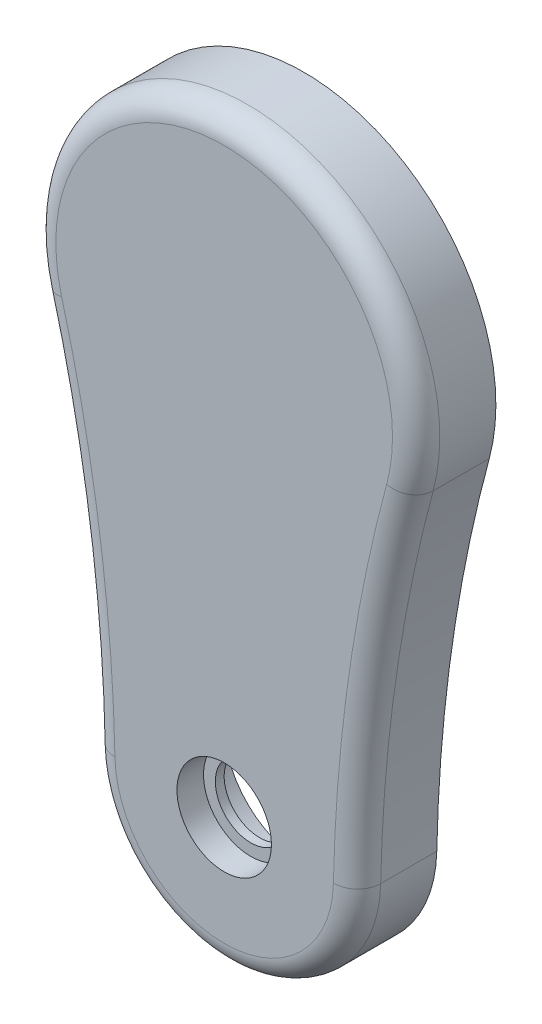
ISO-10303-21;
HEADER;
FILE_DESCRIPTION(('STEP AP214'),'2;1');
FILE_NAME('part.step','',(''),(''),'','','');
FILE_SCHEMA(('AUTOMOTIVE_DESIGN { 1 0 10303 214 1 1 1 1 }'));
ENDSEC;
DATA;
#1=APPLICATION_CONTEXT('core data for automotive mechanical design processes');
#2=APPLICATION_PROTOCOL_DEFINITION('international standard','automotive_design',2000,#1);
#3=PRODUCT_CONTEXT('',#1,'mechanical');
#4=PRODUCT('Part','Part','',(#3));
#5=PRODUCT_RELATED_PRODUCT_CATEGORY('part','',(#4));
#6=PRODUCT_DEFINITION_FORMATION('','',#4);
#7=PRODUCT_DEFINITION_CONTEXT('part definition',#1,'design');
#8=PRODUCT_DEFINITION('design','',#6,#7);
#9=PRODUCT_DEFINITION_SHAPE('','',#8);
#10=(LENGTH_UNIT() NAMED_UNIT(*) SI_UNIT(.MILLI.,.METRE.));
#11=(NAMED_UNIT(*) PLANE_ANGLE_UNIT() SI_UNIT($,.RADIAN.));
#12=(NAMED_UNIT(*) SI_UNIT($,.STERADIAN.) SOLID_ANGLE_UNIT());
#13=UNCERTAINTY_MEASURE_WITH_UNIT(LENGTH_MEASURE(1.E-05),#10,'distance_accuracy_value','');
#14=(GEOMETRIC_REPRESENTATION_CONTEXT(3) GLOBAL_UNCERTAINTY_ASSIGNED_CONTEXT((#13)) GLOBAL_UNIT_ASSIGNED_CONTEXT((#10,
#11,#12)) REPRESENTATION_CONTEXT('',''));
#15=CARTESIAN_POINT('',(0.,0.,0.));
#16=DIRECTION('',(0.,0.,1.));
#17=DIRECTION('',(1.,0.,0.));
#18=AXIS2_PLACEMENT_3D('',#15,#16,#17);
#19=CARTESIAN_POINT('',(0.,55.,13.5));
#20=DIRECTION('',(0.,0.,-1.));
#21=DIRECTION('',(-1.,0.,0.));
#22=AXIS2_PLACEMENT_3D('',#19,#20,#21);
#23=CYLINDRICAL_SURFACE('',#22,6.);
#24=CARTESIAN_POINT('',(0.,55.,7.5));
#25=DIRECTION('',(0.,0.,1.));
#26=DIRECTION('',(1.,0.,0.));
#27=AXIS2_PLACEMENT_3D('',#24,#25,#26);
#28=CIRCLE('',#27,6.);
#29=CARTESIAN_POINT('',(6.,55.,7.5));
#30=VERTEX_POINT('',#29);
#31=EDGE_CURVE('E128',#30,#30,#28,.T.);
#32=ORIENTED_EDGE('',*,*,#31,.F.);
#33=EDGE_LOOP('',(#32));
#34=FACE_BOUND('',#33,.T.);
#35=CARTESIAN_POINT('',(0.,55.,9.));
#36=DIRECTION('',(0.,0.,1.));
#37=DIRECTION('',(1.,0.,0.));
#38=AXIS2_PLACEMENT_3D('',#35,#36,#37);
#39=CIRCLE('',#38,6.);
#40=CARTESIAN_POINT('',(6.,55.,9.));
#41=VERTEX_POINT('',#40);
#42=EDGE_CURVE('E112',#41,#41,#39,.T.);
#43=ORIENTED_EDGE('',*,*,#42,.T.);
#44=EDGE_LOOP('',(#43));
#45=FACE_BOUND('',#44,.T.);
#46=ADVANCED_FACE('F40',(#34,#45),#23,.F.);
#47=CARTESIAN_POINT('',(-282.434749553064,48.9285714285717,13.5));
#48=DIRECTION('',(0.,0.,-1.));
#49=DIRECTION('',(-1.,0.,0.));
#50=AXIS2_PLACEMENT_3D('',#47,#48,#49);
#51=CYLINDRICAL_SURFACE('',#50,260.);
#52=DIRECTION('',(0.,0.,-1.));
#53=VECTOR('',#52,1.);
#54=CARTESIAN_POINT('',(-22.4948030617485,54.5164348925411,13.5));
#55=LINE('',#54,#53);
#56=CARTESIAN_POINT('',(-22.4948030617485,54.5164348925411,9.5));
#57=VERTEX_POINT('',#56);
#58=CARTESIAN_POINT('',(-22.4948030617485,54.5164348925411,0.));
#59=VERTEX_POINT('',#58);
#60=EDGE_CURVE('E92',#57,#59,#55,.T.);
#61=ORIENTED_EDGE('',*,*,#60,.F.);
#62=CARTESIAN_POINT('',(-282.434749553064,48.9285714285717,9.5));
#63=DIRECTION('',(0.,0.,1.));
#64=DIRECTION('',(1.,0.,0.));
#65=AXIS2_PLACEMENT_3D('',#62,#63,#64);
#66=CIRCLE('',#65,260.);
#67=CARTESIAN_POINT('',(-31.3816388392294,116.547619047619,9.5));
#68=VERTEX_POINT('',#67);
#69=EDGE_CURVE('E49',#57,#68,#66,.T.);
#70=ORIENTED_EDGE('',*,*,#69,.T.);
#71=DIRECTION('',(0.,0.,-1.));
#72=VECTOR('',#71,1.);
#73=CARTESIAN_POINT('',(-31.3816388392294,116.547619047619,13.5));
#74=LINE('',#73,#72);
#75=CARTESIAN_POINT('',(-31.3816388392294,116.547619047619,0.));
#76=VERTEX_POINT('',#75);
#77=EDGE_CURVE('E110',#68,#76,#74,.T.);
#78=ORIENTED_EDGE('',*,*,#77,.T.);
#79=CARTESIAN_POINT('',(-282.434749553064,48.9285714285717,0.));
#80=DIRECTION('',(0.,0.,1.));
#81=DIRECTION('',(1.,0.,0.));
#82=AXIS2_PLACEMENT_3D('',#79,#80,#81);
#83=CIRCLE('',#82,260.);
#84=EDGE_CURVE('E105',#59,#76,#83,.T.);
#85=ORIENTED_EDGE('',*,*,#84,.F.);
#86=EDGE_LOOP('',(#61,#70,#78,#85));
#87=FACE_BOUND('',#86,.T.);
#88=ADVANCED_FACE('F109',(#87),#51,.F.);
#89=CARTESIAN_POINT('',(0.,55.,13.5));
#90=DIRECTION('',(0.,0.,-1.));
#91=DIRECTION('',(-1.,0.,0.));
#92=AXIS2_PLACEMENT_3D('',#89,#90,#91);
#93=CYLINDRICAL_SURFACE('',#92,22.5);
#94=DIRECTION('',(0.,0.,-1.));
#95=VECTOR('',#94,1.);
#96=CARTESIAN_POINT('',(22.4948030617485,54.5164348925411,13.5));
#97=LINE('',#96,#95);
#98=CARTESIAN_POINT('',(22.4948030617485,54.5164348925411,9.5));
#99=VERTEX_POINT('',#98);
#100=CARTESIAN_POINT('',(22.4948030617485,54.5164348925411,0.));
#101=VERTEX_POINT('',#100);
#102=EDGE_CURVE('E99',#99,#101,#97,.T.);
#103=ORIENTED_EDGE('',*,*,#102,.F.);
#104=CARTESIAN_POINT('',(0.,55.,9.5));
#105=DIRECTION('',(0.,0.,1.));
#106=DIRECTION('',(1.,0.,0.));
#107=AXIS2_PLACEMENT_3D('',#104,#105,#106);
#108=CIRCLE('',#107,22.5);
#109=EDGE_CURVE('E64',#99,#57,#108,.F.);
#110=ORIENTED_EDGE('',*,*,#109,.T.);
#111=ORIENTED_EDGE('',*,*,#60,.T.);
#112=CARTESIAN_POINT('',(0.,55.,0.));
#113=DIRECTION('',(0.,0.,1.));
#114=DIRECTION('',(1.,0.,0.));
#115=AXIS2_PLACEMENT_3D('',#112,#113,#114);
#116=CIRCLE('',#115,22.5);
#117=EDGE_CURVE('E95',#59,#101,#116,.T.);
#118=ORIENTED_EDGE('',*,*,#117,.T.);
#119=EDGE_LOOP('',(#103,#110,#111,#118));
#120=FACE_BOUND('',#119,.T.);
#121=ADVANCED_FACE('F94',(#120),#93,.T.);
#122=CARTESIAN_POINT('',(282.434749553064,48.9285714285717,13.5));
#123=DIRECTION('',(0.,0.,-1.));
#124=DIRECTION('',(-1.,0.,0.));
#125=AXIS2_PLACEMENT_3D('',#122,#123,#124);
#126=CYLINDRICAL_SURFACE('',#125,260.);
#127=DIRECTION('',(0.,0.,-1.));
#128=VECTOR('',#127,1.);
#129=CARTESIAN_POINT('',(31.3816388392294,116.547619047619,13.5));
#130=LINE('',#129,#128);
#131=CARTESIAN_POINT('',(31.3816388392294,116.547619047619,9.5));
#132=VERTEX_POINT('',#131);
#133=CARTESIAN_POINT('',(31.3816388392294,116.547619047619,0.));
#134=VERTEX_POINT('',#133);
#135=EDGE_CURVE('E125',#132,#134,#130,.T.);
#136=ORIENTED_EDGE('',*,*,#135,.F.);
#137=CARTESIAN_POINT('',(282.434749553064,48.9285714285717,9.5));
#138=DIRECTION('',(0.,0.,1.));
#139=DIRECTION('',(1.,0.,0.));
#140=AXIS2_PLACEMENT_3D('',#137,#138,#139);
#141=CIRCLE('',#140,260.);
#142=EDGE_CURVE('E98',#132,#99,#141,.T.);
#143=ORIENTED_EDGE('',*,*,#142,.T.);
#144=ORIENTED_EDGE('',*,*,#102,.T.);
#145=CARTESIAN_POINT('',(282.434749553064,48.9285714285717,0.));
#146=DIRECTION('',(0.,0.,1.));
#147=DIRECTION('',(1.,0.,0.));
#148=AXIS2_PLACEMENT_3D('',#145,#146,#147);
#149=CIRCLE('',#148,260.);
#150=EDGE_CURVE('E107',#134,#101,#149,.T.);
#151=ORIENTED_EDGE('',*,*,#150,.F.);
#152=EDGE_LOOP('',(#136,#143,#144,#151));
#153=FACE_BOUND('',#152,.T.);
#154=ADVANCED_FACE('F203',(#153),#126,.F.);
#155=CARTESIAN_POINT('',(0.,125.,13.5));
#156=DIRECTION('',(0.,0.,-1.));
#157=DIRECTION('',(-1.,0.,0.));
#158=AXIS2_PLACEMENT_3D('',#155,#156,#157);
#159=CYLINDRICAL_SURFACE('',#158,32.5);
#160=ORIENTED_EDGE('',*,*,#77,.F.);
#161=CARTESIAN_POINT('',(0.,125.,9.5));
#162=DIRECTION('',(0.,0.,1.));
#163=DIRECTION('',(1.,0.,0.));
#164=AXIS2_PLACEMENT_3D('',#161,#162,#163);
#165=CIRCLE('',#164,32.5);
#166=EDGE_CURVE('E12',#68,#132,#165,.F.);
#167=ORIENTED_EDGE('',*,*,#166,.T.);
#168=ORIENTED_EDGE('',*,*,#135,.T.);
#169=CARTESIAN_POINT('',(0.,125.,0.));
#170=DIRECTION('',(0.,0.,1.));
#171=DIRECTION('',(1.,0.,0.));
#172=AXIS2_PLACEMENT_3D('',#169,#170,#171);
#173=CIRCLE('',#172,32.5);
#174=EDGE_CURVE('E122',#134,#76,#173,.T.);
#175=ORIENTED_EDGE('',*,*,#174,.T.);
#176=EDGE_LOOP('',(#160,#167,#168,#175));
#177=FACE_BOUND('',#176,.T.);
#178=ADVANCED_FACE('F198',(#177),#159,.T.);
#179=CARTESIAN_POINT('',(0.,0.,13.5));
#180=DIRECTION('',(0.,0.,1.));
#181=DIRECTION('',(1.,0.,0.));
#182=AXIS2_PLACEMENT_3D('',#179,#180,#181);
#183=PLANE('',#182);
#184=CARTESIAN_POINT('',(0.,55.,13.5));
#185=DIRECTION('',(0.,0.,1.));
#186=DIRECTION('',(1.,0.,0.));
#187=AXIS2_PLACEMENT_3D('',#184,#185,#186);
#188=CIRCLE('',#187,18.5);
#189=CARTESIAN_POINT('',(-18.4957269618821,54.602402022756,13.5));
#190=VERTEX_POINT('',#189);
#191=CARTESIAN_POINT('',(18.4957269618821,54.602402022756,13.5));
#192=VERTEX_POINT('',#191);
#193=EDGE_CURVE('E138',#190,#192,#188,.T.);
#194=ORIENTED_EDGE('',*,*,#193,.T.);
#195=CARTESIAN_POINT('',(282.434749553064,48.9285714285717,13.5));
#196=DIRECTION('',(0.,0.,1.));
#197=DIRECTION('',(1.,0.,0.));
#198=AXIS2_PLACEMENT_3D('',#195,#196,#197);
#199=CIRCLE('',#198,264.);
#200=CARTESIAN_POINT('',(27.5192832897857,117.587912087912,13.5));
#201=VERTEX_POINT('',#200);
#202=EDGE_CURVE('E140',#192,#201,#199,.F.);
#203=ORIENTED_EDGE('',*,*,#202,.T.);
#204=CARTESIAN_POINT('',(0.,125.,13.5));
#205=DIRECTION('',(0.,0.,1.));
#206=DIRECTION('',(1.,0.,0.));
#207=AXIS2_PLACEMENT_3D('',#204,#205,#206);
#208=CIRCLE('',#207,28.5);
#209=CARTESIAN_POINT('',(-27.5192832897857,117.587912087912,13.5));
#210=VERTEX_POINT('',#209);
#211=EDGE_CURVE('E134',#201,#210,#208,.T.);
#212=ORIENTED_EDGE('',*,*,#211,.T.);
#213=CARTESIAN_POINT('',(-282.434749553064,48.9285714285717,13.5));
#214=DIRECTION('',(0.,0.,1.));
#215=DIRECTION('',(1.,0.,0.));
#216=AXIS2_PLACEMENT_3D('',#213,#214,#215);
#217=CIRCLE('',#216,264.);
#218=EDGE_CURVE('E136',#210,#190,#217,.F.);
#219=ORIENTED_EDGE('',*,*,#218,.T.);
#220=EDGE_LOOP('',(#194,#203,#212,#219));
#221=FACE_BOUND('',#220,.T.);
#222=CARTESIAN_POINT('',(0.,55.,13.5));
#223=DIRECTION('',(0.,0.,1.));
#224=DIRECTION('',(1.,0.,0.));
#225=AXIS2_PLACEMENT_3D('',#222,#223,#224);
#226=CIRCLE('',#225,8.);
#227=CARTESIAN_POINT('',(8.,55.,13.5));
#228=VERTEX_POINT('',#227);
#229=EDGE_CURVE('E115',#228,#228,#226,.T.);
#230=ORIENTED_EDGE('',*,*,#229,.F.);
#231=EDGE_LOOP('',(#230));
#232=FACE_BOUND('',#231,.T.);
#233=ADVANCED_FACE('F184',(#221,#232),#183,.T.);
#234=CARTESIAN_POINT('',(0.,0.,0.));
#235=DIRECTION('',(0.,0.,1.));
#236=DIRECTION('',(1.,0.,0.));
#237=AXIS2_PLACEMENT_3D('',#234,#235,#236);
#238=PLANE('',#237);
#239=CARTESIAN_POINT('',(0.,125.,0.));
#240=DIRECTION('',(0.,0.,1.));
#241=DIRECTION('',(1.,0.,0.));
#242=AXIS2_PLACEMENT_3D('',#239,#240,#241);
#243=CIRCLE('',#242,23.5);
#244=CARTESIAN_POINT('',(23.5,125.,0.));
#245=VERTEX_POINT('',#244);
#246=EDGE_CURVE('E268',#245,#245,#243,.T.);
#247=ORIENTED_EDGE('',*,*,#246,.T.);
#248=EDGE_LOOP('',(#247));
#249=FACE_BOUND('',#248,.T.);
#250=CARTESIAN_POINT('',(0.,55.,0.));
#251=DIRECTION('',(0.,0.,1.));
#252=DIRECTION('',(1.,0.,0.));
#253=AXIS2_PLACEMENT_3D('',#250,#251,#252);
#254=CIRCLE('',#253,13.5);
#255=CARTESIAN_POINT('',(13.5,55.,0.));
#256=VERTEX_POINT('',#255);
#257=EDGE_CURVE('E154',#256,#256,#254,.T.);
#258=ORIENTED_EDGE('',*,*,#257,.T.);
#259=EDGE_LOOP('',(#258));
#260=FACE_BOUND('',#259,.T.);
#261=ORIENTED_EDGE('',*,*,#84,.T.);
#262=ORIENTED_EDGE('',*,*,#174,.F.);
#263=ORIENTED_EDGE('',*,*,#150,.T.);
#264=ORIENTED_EDGE('',*,*,#117,.F.);
#265=EDGE_LOOP('',(#261,#262,#263,#264));
#266=FACE_BOUND('',#265,.T.);
#267=ADVANCED_FACE('F103',(#249,#260,#266),#238,.F.);
#268=CARTESIAN_POINT('',(0.,55.,13.5));
#269=DIRECTION('',(0.,0.,-1.));
#270=DIRECTION('',(-1.,0.,0.));
#271=AXIS2_PLACEMENT_3D('',#268,#269,#270);
#272=CYLINDRICAL_SURFACE('',#271,8.);
#273=ORIENTED_EDGE('',*,*,#229,.T.);
#274=EDGE_LOOP('',(#273));
#275=FACE_BOUND('',#274,.T.);
#276=CARTESIAN_POINT('',(0.,55.,9.));
#277=DIRECTION('',(0.,0.,1.));
#278=DIRECTION('',(1.,0.,0.));
#279=AXIS2_PLACEMENT_3D('',#276,#277,#278);
#280=CIRCLE('',#279,8.);
#281=CARTESIAN_POINT('',(8.,55.,9.));
#282=VERTEX_POINT('',#281);
#283=EDGE_CURVE('E118',#282,#282,#280,.T.);
#284=ORIENTED_EDGE('',*,*,#283,.F.);
#285=EDGE_LOOP('',(#284));
#286=FACE_BOUND('',#285,.T.);
#287=ADVANCED_FACE('F174',(#275,#286),#272,.F.);
#288=CARTESIAN_POINT('',(0.,55.,9.));
#289=DIRECTION('',(0.,0.,1.));
#290=DIRECTION('',(1.,0.,0.));
#291=AXIS2_PLACEMENT_3D('',#288,#289,#290);
#292=PLANE('',#291);
#293=ORIENTED_EDGE('',*,*,#42,.F.);
#294=EDGE_LOOP('',(#293));
#295=FACE_BOUND('',#294,.T.);
#296=ORIENTED_EDGE('',*,*,#283,.T.);
#297=EDGE_LOOP('',(#296));
#298=FACE_BOUND('',#297,.T.);
#299=ADVANCED_FACE('F172',(#295,#298),#292,.T.);
#300=CARTESIAN_POINT('',(0.,55.,7.5));
#301=DIRECTION('',(0.,0.,-1.));
#302=DIRECTION('',(-1.,0.,0.));
#303=AXIS2_PLACEMENT_3D('',#300,#301,#302);
#304=CYLINDRICAL_SURFACE('',#303,13.5);
#305=CARTESIAN_POINT('',(0.,55.,7.5));
#306=DIRECTION('',(0.,0.,1.));
#307=DIRECTION('',(1.,0.,0.));
#308=AXIS2_PLACEMENT_3D('',#305,#306,#307);
#309=CIRCLE('',#308,13.5);
#310=CARTESIAN_POINT('',(13.5,55.,7.5));
#311=VERTEX_POINT('',#310);
#312=EDGE_CURVE('E131',#311,#311,#309,.T.);
#313=ORIENTED_EDGE('',*,*,#312,.T.);
#314=EDGE_LOOP('',(#313));
#315=FACE_BOUND('',#314,.T.);
#316=ORIENTED_EDGE('',*,*,#257,.F.);
#317=EDGE_LOOP('',(#316));
#318=FACE_BOUND('',#317,.T.);
#319=ADVANCED_FACE('F181',(#315,#318),#304,.F.);
#320=CARTESIAN_POINT('',(0.,55.,7.5));
#321=DIRECTION('',(0.,0.,1.));
#322=DIRECTION('',(1.,0.,0.));
#323=AXIS2_PLACEMENT_3D('',#320,#321,#322);
#324=PLANE('',#323);
#325=ORIENTED_EDGE('',*,*,#31,.T.);
#326=EDGE_LOOP('',(#325));
#327=FACE_BOUND('',#326,.T.);
#328=ORIENTED_EDGE('',*,*,#312,.F.);
#329=EDGE_LOOP('',(#328));
#330=FACE_BOUND('',#329,.T.);
#331=ADVANCED_FACE('F223',(#327,#330),#324,.F.);
#332=CARTESIAN_POINT('',(-282.434749553064,48.9285714285717,9.5));
#333=DIRECTION('',(0.,0.,1.));
#334=DIRECTION('',(1.,0.,0.));
#335=AXIS2_PLACEMENT_3D('',#332,#333,#334);
#336=TOROIDAL_SURFACE('',#335,264.,4.);
#337=CARTESIAN_POINT('',(-18.4957269618821,54.602402022756,9.5));
#338=DIRECTION('',(0.0214917825537289,-0.999769024966598,0.));
#339=DIRECTION('',(0.999769024966599,0.0214917825537289,0.));
#340=AXIS2_PLACEMENT_3D('',#337,#338,#339);
#341=CIRCLE('',#340,4.);
#342=EDGE_CURVE('E150',#190,#57,#341,.T.);
#343=ORIENTED_EDGE('',*,*,#342,.F.);
#344=ORIENTED_EDGE('',*,*,#218,.F.);
#345=CARTESIAN_POINT('',(-27.5192832897857,117.587912087912,9.5));
#346=DIRECTION('',(-0.260073260073258,0.965588887360904,0.));
#347=DIRECTION('',(-0.965588887360904,-0.260073260073258,0.));
#348=AXIS2_PLACEMENT_3D('',#345,#346,#347);
#349=CIRCLE('',#348,4.);
#350=EDGE_CURVE('E152',#68,#210,#349,.T.);
#351=ORIENTED_EDGE('',*,*,#350,.F.);
#352=ORIENTED_EDGE('',*,*,#69,.F.);
#353=EDGE_LOOP('',(#343,#344,#351,#352));
#354=FACE_BOUND('',#353,.T.);
#355=ADVANCED_FACE('F42',(#354),#336,.T.);
#356=CARTESIAN_POINT('',(0.,125.,9.5));
#357=DIRECTION('',(0.,0.,1.));
#358=DIRECTION('',(1.,0.,0.));
#359=AXIS2_PLACEMENT_3D('',#356,#357,#358);
#360=TOROIDAL_SURFACE('',#359,28.5,4.);
#361=ORIENTED_EDGE('',*,*,#350,.T.);
#362=ORIENTED_EDGE('',*,*,#211,.F.);
#363=CARTESIAN_POINT('',(27.5192832897857,117.587912087912,9.5));
#364=DIRECTION('',(-0.260073260073258,-0.965588887360904,0.));
#365=DIRECTION('',(0.965588887360904,-0.260073260073258,0.));
#366=AXIS2_PLACEMENT_3D('',#363,#364,#365);
#367=CIRCLE('',#366,4.);
#368=EDGE_CURVE('E147',#132,#201,#367,.T.);
#369=ORIENTED_EDGE('',*,*,#368,.F.);
#370=ORIENTED_EDGE('',*,*,#166,.F.);
#371=EDGE_LOOP('',(#361,#362,#369,#370));
#372=FACE_BOUND('',#371,.T.);
#373=ADVANCED_FACE('F217',(#372),#360,.T.);
#374=CARTESIAN_POINT('',(0.,55.,9.5));
#375=DIRECTION('',(0.,0.,1.));
#376=DIRECTION('',(1.,0.,0.));
#377=AXIS2_PLACEMENT_3D('',#374,#375,#376);
#378=TOROIDAL_SURFACE('',#377,18.5,4.);
#379=ORIENTED_EDGE('',*,*,#342,.T.);
#380=ORIENTED_EDGE('',*,*,#109,.F.);
#381=CARTESIAN_POINT('',(18.4957269618821,54.602402022756,9.5));
#382=DIRECTION('',(0.0214917825537287,0.999769024966598,0.));
#383=DIRECTION('',(-0.999769024966599,0.0214917825537287,0.));
#384=AXIS2_PLACEMENT_3D('',#381,#382,#383);
#385=CIRCLE('',#384,4.);
#386=EDGE_CURVE('E145',#192,#99,#385,.T.);
#387=ORIENTED_EDGE('',*,*,#386,.F.);
#388=ORIENTED_EDGE('',*,*,#193,.F.);
#389=EDGE_LOOP('',(#379,#380,#387,#388));
#390=FACE_BOUND('',#389,.T.);
#391=ADVANCED_FACE('F214',(#390),#378,.T.);
#392=CARTESIAN_POINT('',(282.434749553064,48.9285714285717,9.5));
#393=DIRECTION('',(0.,0.,1.));
#394=DIRECTION('',(1.,0.,0.));
#395=AXIS2_PLACEMENT_3D('',#392,#393,#394);
#396=TOROIDAL_SURFACE('',#395,264.,4.);
#397=ORIENTED_EDGE('',*,*,#368,.T.);
#398=ORIENTED_EDGE('',*,*,#202,.F.);
#399=ORIENTED_EDGE('',*,*,#386,.T.);
#400=ORIENTED_EDGE('',*,*,#142,.F.);
#401=EDGE_LOOP('',(#397,#398,#399,#400));
#402=FACE_BOUND('',#401,.T.);
#403=ADVANCED_FACE('F210',(#402),#396,.T.);
#404=CARTESIAN_POINT('',(0.,125.,7.));
#405=DIRECTION('',(0.,0.,-1.));
#406=DIRECTION('',(-1.,0.,0.));
#407=AXIS2_PLACEMENT_3D('',#404,#405,#406);
#408=CYLINDRICAL_SURFACE('',#407,23.5);
#409=CARTESIAN_POINT('',(0.,125.,7.));
#410=DIRECTION('',(0.,0.,1.));
#411=DIRECTION('',(1.,0.,0.));
#412=AXIS2_PLACEMENT_3D('',#409,#410,#411);
#413=CIRCLE('',#412,23.5);
#414=CARTESIAN_POINT('',(23.5,125.,7.));
#415=VERTEX_POINT('',#414);
#416=EDGE_CURVE('E267',#415,#415,#413,.T.);
#417=ORIENTED_EDGE('',*,*,#416,.T.);
#418=EDGE_LOOP('',(#417));
#419=FACE_BOUND('',#418,.T.);
#420=ORIENTED_EDGE('',*,*,#246,.F.);
#421=EDGE_LOOP('',(#420));
#422=FACE_BOUND('',#421,.T.);
#423=ADVANCED_FACE('F213',(#419,#422),#408,.F.);
#424=CARTESIAN_POINT('',(0.,125.,7.));
#425=DIRECTION('',(0.,0.,1.));
#426=DIRECTION('',(1.,0.,0.));
#427=AXIS2_PLACEMENT_3D('',#424,#425,#426);
#428=PLANE('',#427);
#429=CARTESIAN_POINT('',(0.,125.,7.));
#430=DIRECTION('',(0.,0.,1.));
#431=DIRECTION('',(1.,0.,0.));
#432=AXIS2_PLACEMENT_3D('',#429,#430,#431);
#433=CIRCLE('',#432,21.);
#434=CARTESIAN_POINT('',(-21.,125.,7.));
#435=VERTEX_POINT('',#434);
#436=EDGE_CURVE('E44',#435,#435,#433,.T.);
#437=ORIENTED_EDGE('',*,*,#436,.T.);
#438=EDGE_LOOP('',(#437));
#439=FACE_BOUND('',#438,.T.);
#440=ORIENTED_EDGE('',*,*,#416,.F.);
#441=EDGE_LOOP('',(#440));
#442=FACE_BOUND('',#441,.T.);
#443=ADVANCED_FACE('F253',(#439,#442),#428,.F.);
#444=CARTESIAN_POINT('',(0.,0.,10.5));
#445=DIRECTION('',(0.,0.,1.));
#446=DIRECTION('',(1.,0.,0.));
#447=AXIS2_PLACEMENT_3D('',#444,#445,#446);
#448=PLANE('',#447);
#449=CARTESIAN_POINT('',(0.,125.,10.5));
#450=DIRECTION('',(0.,0.,1.));
#451=DIRECTION('',(1.,0.,0.));
#452=AXIS2_PLACEMENT_3D('',#449,#450,#451);
#453=CIRCLE('',#452,21.);
#454=CARTESIAN_POINT('',(-21.,125.,10.5));
#455=VERTEX_POINT('',#454);
#456=EDGE_CURVE('E148',#455,#455,#453,.T.);
#457=ORIENTED_EDGE('',*,*,#456,.F.);
#458=EDGE_LOOP('',(#457));
#459=FACE_BOUND('',#458,.T.);
#460=ADVANCED_FACE('F249',(#459),#448,.F.);
#461=CARTESIAN_POINT('',(0.,125.,10.5));
#462=DIRECTION('',(0.,0.,-1.));
#463=DIRECTION('',(-1.,0.,0.));
#464=AXIS2_PLACEMENT_3D('',#461,#462,#463);
#465=CYLINDRICAL_SURFACE('',#464,21.);
#466=CARTESIAN_POINT('',(-21.,125.,7.));
#467=CARTESIAN_POINT('',(-21.,125.,7.03645833333333));
#468=CARTESIAN_POINT('',(-21.,125.,7.07291666666667));
#469=CARTESIAN_POINT('',(-21.,125.,7.14583333333333));
#470=CARTESIAN_POINT('',(-21.,125.,7.18229166666667));
#471=CARTESIAN_POINT('',(-21.,125.,7.25520833333333));
#472=CARTESIAN_POINT('',(-21.,125.,7.29166666666667));
#473=CARTESIAN_POINT('',(-21.,125.,7.36458333333333));
#474=CARTESIAN_POINT('',(-21.,125.,7.40104166666667));
#475=CARTESIAN_POINT('',(-21.,125.,7.47395833333333));
#476=CARTESIAN_POINT('',(-21.,125.,7.51041666666667));
#477=CARTESIAN_POINT('',(-21.,125.,7.58333333333333));
#478=CARTESIAN_POINT('',(-21.,125.,7.61979166666667));
#479=CARTESIAN_POINT('',(-21.,125.,7.69270833333333));
#480=CARTESIAN_POINT('',(-21.,125.,7.72916666666667));
#481=CARTESIAN_POINT('',(-21.,125.,7.80208333333333));
#482=CARTESIAN_POINT('',(-21.,125.,7.83854166666667));
#483=CARTESIAN_POINT('',(-21.,125.,7.91145833333333));
#484=CARTESIAN_POINT('',(-21.,125.,7.94791666666667));
#485=CARTESIAN_POINT('',(-21.,125.,8.02083333333333));
#486=CARTESIAN_POINT('',(-21.,125.,8.05729166666667));
#487=CARTESIAN_POINT('',(-21.,125.,8.13020833333333));
#488=CARTESIAN_POINT('',(-21.,125.,8.16666666666667));
#489=CARTESIAN_POINT('',(-21.,125.,8.23958333333333));
#490=CARTESIAN_POINT('',(-21.,125.,8.27604166666667));
#491=CARTESIAN_POINT('',(-21.,125.,8.34895833333333));
#492=CARTESIAN_POINT('',(-21.,125.,8.38541666666667));
#493=CARTESIAN_POINT('',(-21.,125.,8.45833333333333));
#494=CARTESIAN_POINT('',(-21.,125.,8.49479166666667));
#495=CARTESIAN_POINT('',(-21.,125.,8.56770833333333));
#496=CARTESIAN_POINT('',(-21.,125.,8.60416666666667));
#497=CARTESIAN_POINT('',(-21.,125.,8.67708333333333));
#498=CARTESIAN_POINT('',(-21.,125.,8.71354166666667));
#499=CARTESIAN_POINT('',(-21.,125.,8.78645833333333));
#500=CARTESIAN_POINT('',(-21.,125.,8.82291666666667));
#501=CARTESIAN_POINT('',(-21.,125.,8.89583333333333));
#502=CARTESIAN_POINT('',(-21.,125.,8.93229166666667));
#503=CARTESIAN_POINT('',(-21.,125.,9.00520833333333));
#504=CARTESIAN_POINT('',(-21.,125.,9.04166666666667));
#505=CARTESIAN_POINT('',(-21.,125.,9.11458333333333));
#506=CARTESIAN_POINT('',(-21.,125.,9.15104166666667));
#507=CARTESIAN_POINT('',(-21.,125.,9.22395833333333));
#508=CARTESIAN_POINT('',(-21.,125.,9.26041666666667));
#509=CARTESIAN_POINT('',(-21.,125.,9.33333333333333));
#510=CARTESIAN_POINT('',(-21.,125.,9.36979166666667));
#511=CARTESIAN_POINT('',(-21.,125.,9.44270833333333));
#512=CARTESIAN_POINT('',(-21.,125.,9.47916666666667));
#513=CARTESIAN_POINT('',(-21.,125.,9.55208333333333));
#514=CARTESIAN_POINT('',(-21.,125.,9.58854166666667));
#515=CARTESIAN_POINT('',(-21.,125.,9.66145833333333));
#516=CARTESIAN_POINT('',(-21.,125.,9.69791666666667));
#517=CARTESIAN_POINT('',(-21.,125.,9.77083333333333));
#518=CARTESIAN_POINT('',(-21.,125.,9.80729166666667));
#519=CARTESIAN_POINT('',(-21.,125.,9.88020833333333));
#520=CARTESIAN_POINT('',(-21.,125.,9.91666666666667));
#521=CARTESIAN_POINT('',(-21.,125.,9.98958333333333));
#522=CARTESIAN_POINT('',(-21.,125.,10.0260416666667));
#523=CARTESIAN_POINT('',(-21.,125.,10.0989583333333));
#524=CARTESIAN_POINT('',(-21.,125.,10.1354166666667));
#525=CARTESIAN_POINT('',(-21.,125.,10.2083333333333));
#526=CARTESIAN_POINT('',(-21.,125.,10.2447916666667));
#527=CARTESIAN_POINT('',(-21.,125.,10.3177083333333));
#528=CARTESIAN_POINT('',(-21.,125.,10.3541666666667));
#529=CARTESIAN_POINT('',(-21.,125.,10.4270833333333));
#530=CARTESIAN_POINT('',(-21.,125.,10.4635416666667));
#531=CARTESIAN_POINT('',(-21.,125.,10.5));
#532=B_SPLINE_CURVE_WITH_KNOTS('',3,(#466,#467,#468,#469,#470,#471,#472,#473,#474,#475,#476,
#477,#478,#479,#480,#481,#482,#483,#484,#485,#486,#487,#488,#489,#490,#491,#492,#493,#494,#495,
#496,#497,#498,#499,#500,#501,#502,#503,#504,#505,#506,#507,#508,#509,#510,#511,#512,#513,#514,
#515,#516,#517,#518,#519,#520,#521,#522,#523,#524,#525,#526,#527,#528,#529,#530,#531),
.UNSPECIFIED.,.F.,.F.,(4,2,2,2,2,2,2,2,2,2,2,2,2,2,2,2,2,2,2,2,2,2,2,2,2,2,2,2,2,2,2,2,4),(0.,
0.109375,0.21875,0.328125,0.4375,0.546875,0.656250000000001,0.765625000000001,0.875000000000001,
0.984375000000001,1.09375,1.203125,1.3125,1.421875,1.53125,1.640625,1.75,1.859375,1.96875,
2.078125,2.1875,2.296875,2.40625,2.515625,2.625,2.734375,2.84375,2.953125,3.0625,3.171875,
3.28125,3.390625,3.5),.UNSPECIFIED.);
#533=EDGE_CURVE('BSEAM246',#435,#455,#532,.T.);
#534=ORIENTED_EDGE('',*,*,#436,.F.);
#535=ORIENTED_EDGE('',*,*,#456,.T.);
#536=ORIENTED_EDGE('',*,*,#533,.T.);
#537=ORIENTED_EDGE('',*,*,#533,.F.);
#538=EDGE_LOOP('',(#534,#536,#535,#537));
#539=FACE_BOUND('',#538,.T.);
#540=ADVANCED_FACE('F246',(#539),#465,.F.);
#541=CLOSED_SHELL('',(#46,#88,#121,#154,#178,#233,#267,#287,#299,#319,#331,#355,#373,#391,#403,
#423,#443,#460,#540));
#542=MANIFOLD_SOLID_BREP('B2',#541);
#543=ADVANCED_BREP_SHAPE_REPRESENTATION('',(#18,#542),#14);
#544=SHAPE_DEFINITION_REPRESENTATION(#9,#543);
ENDSEC;
END-ISO-10303-21;
